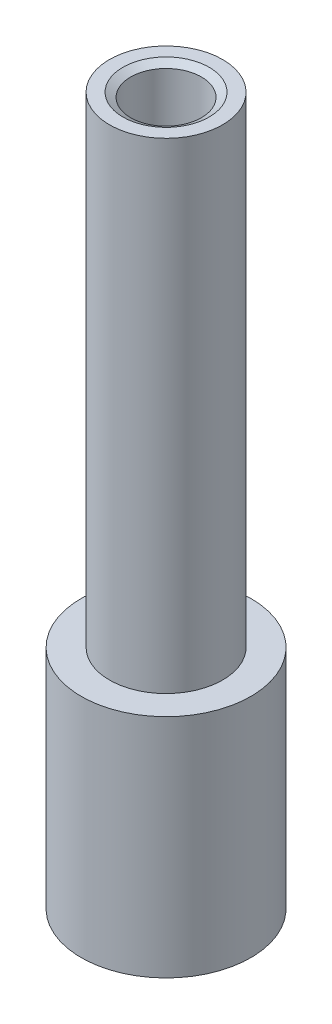
ISO-10303-21;
HEADER;
FILE_DESCRIPTION(('STEP AP214'),'2;1');
FILE_NAME('part.step','',(''),(''),'','','');
FILE_SCHEMA(('AUTOMOTIVE_DESIGN { 1 0 10303 214 1 1 1 1 }'));
ENDSEC;
DATA;
#1=APPLICATION_CONTEXT('core data for automotive mechanical design processes');
#2=APPLICATION_PROTOCOL_DEFINITION('international standard','automotive_design',2000,#1);
#3=PRODUCT_CONTEXT('',#1,'mechanical');
#4=PRODUCT('Part','Part','',(#3));
#5=PRODUCT_RELATED_PRODUCT_CATEGORY('part','',(#4));
#6=PRODUCT_DEFINITION_FORMATION('','',#4);
#7=PRODUCT_DEFINITION_CONTEXT('part definition',#1,'design');
#8=PRODUCT_DEFINITION('design','',#6,#7);
#9=PRODUCT_DEFINITION_SHAPE('','',#8);
#10=(LENGTH_UNIT() NAMED_UNIT(*) SI_UNIT(.MILLI.,.METRE.));
#11=(NAMED_UNIT(*) PLANE_ANGLE_UNIT() SI_UNIT($,.RADIAN.));
#12=(NAMED_UNIT(*) SI_UNIT($,.STERADIAN.) SOLID_ANGLE_UNIT());
#13=UNCERTAINTY_MEASURE_WITH_UNIT(LENGTH_MEASURE(1.E-05),#10,'distance_accuracy_value','');
#14=(GEOMETRIC_REPRESENTATION_CONTEXT(3) GLOBAL_UNCERTAINTY_ASSIGNED_CONTEXT((#13)) GLOBAL_UNIT_ASSIGNED_CONTEXT((#10,
#11,#12)) REPRESENTATION_CONTEXT('',''));
#15=CARTESIAN_POINT('',(0.,0.,0.));
#16=DIRECTION('',(0.,0.,1.));
#17=DIRECTION('',(1.,0.,0.));
#18=AXIS2_PLACEMENT_3D('',#15,#16,#17);
#19=CARTESIAN_POINT('',(0.,0.01,-3.));
#20=DIRECTION('',(0.,-1.,0.));
#21=DIRECTION('',(0.,0.,-1.));
#22=AXIS2_PLACEMENT_3D('',#19,#20,#21);
#23=PLANE('',#22);
#24=CARTESIAN_POINT('',(0.,0.01,0.));
#25=DIRECTION('',(0.,-1.,0.));
#26=DIRECTION('',(0.,0.,-1.));
#27=AXIS2_PLACEMENT_3D('',#24,#25,#26);
#28=CIRCLE('',#27,2.00767949192431);
#29=CARTESIAN_POINT('',(0.,0.01,-2.00767949192431));
#30=VERTEX_POINT('',#29);
#31=EDGE_CURVE('E39',#30,#30,#28,.T.);
#32=ORIENTED_EDGE('',*,*,#31,.F.);
#33=EDGE_LOOP('',(#32));
#34=FACE_BOUND('',#33,.T.);
#35=CARTESIAN_POINT('',(0.,0.01,0.));
#36=DIRECTION('',(0.,-1.,0.));
#37=DIRECTION('',(0.,0.,-1.));
#38=AXIS2_PLACEMENT_3D('',#35,#36,#37);
#39=CIRCLE('',#38,3.);
#40=CARTESIAN_POINT('',(0.,0.01,-3.));
#41=VERTEX_POINT('',#40);
#42=EDGE_CURVE('E11',#41,#41,#39,.T.);
#43=ORIENTED_EDGE('',*,*,#42,.T.);
#44=EDGE_LOOP('',(#43));
#45=FACE_BOUND('',#44,.T.);
#46=ADVANCED_FACE('F36',(#34,#45),#23,.T.);
#47=CARTESIAN_POINT('',(0.,0.,0.));
#48=DIRECTION('',(0.,-1.,0.));
#49=DIRECTION('',(0.,0.,-1.));
#50=AXIS2_PLACEMENT_3D('',#47,#48,#49);
#51=CYLINDRICAL_SURFACE('',#50,3.);
#52=CARTESIAN_POINT('',(0.,8.01,0.));
#53=DIRECTION('',(0.,-1.,0.));
#54=DIRECTION('',(0.,0.,-1.));
#55=AXIS2_PLACEMENT_3D('',#52,#53,#54);
#56=CIRCLE('',#55,3.);
#57=CARTESIAN_POINT('',(0.,8.01,-3.));
#58=VERTEX_POINT('',#57);
#59=EDGE_CURVE('E44',#58,#58,#56,.T.);
#60=ORIENTED_EDGE('',*,*,#59,.T.);
#61=EDGE_LOOP('',(#60));
#62=FACE_BOUND('',#61,.T.);
#63=ORIENTED_EDGE('',*,*,#42,.F.);
#64=EDGE_LOOP('',(#63));
#65=FACE_BOUND('',#64,.T.);
#66=ADVANCED_FACE('F84',(#62,#65),#51,.T.);
#67=CARTESIAN_POINT('',(0.,8.01,-3.));
#68=DIRECTION('',(0.,1.,0.));
#69=DIRECTION('',(0.,0.,1.));
#70=AXIS2_PLACEMENT_3D('',#67,#68,#69);
#71=PLANE('',#70);
#72=CARTESIAN_POINT('',(0.,8.01,0.));
#73=DIRECTION('',(0.,-1.,0.));
#74=DIRECTION('',(0.,0.,-1.));
#75=AXIS2_PLACEMENT_3D('',#72,#73,#74);
#76=CIRCLE('',#75,2.);
#77=CARTESIAN_POINT('',(0.,8.01,-2.));
#78=VERTEX_POINT('',#77);
#79=EDGE_CURVE('E78',#78,#78,#76,.T.);
#80=ORIENTED_EDGE('',*,*,#79,.T.);
#81=EDGE_LOOP('',(#80));
#82=FACE_BOUND('',#81,.T.);
#83=ORIENTED_EDGE('',*,*,#59,.F.);
#84=EDGE_LOOP('',(#83));
#85=FACE_BOUND('',#84,.T.);
#86=ADVANCED_FACE('F87',(#82,#85),#71,.T.);
#87=CARTESIAN_POINT('',(0.,0.,0.));
#88=DIRECTION('',(0.,-1.,0.));
#89=DIRECTION('',(0.,0.,-1.));
#90=AXIS2_PLACEMENT_3D('',#87,#88,#89);
#91=CYLINDRICAL_SURFACE('',#90,2.);
#92=CARTESIAN_POINT('',(0.,25.01,0.));
#93=DIRECTION('',(0.,-1.,0.));
#94=DIRECTION('',(0.,0.,-1.));
#95=AXIS2_PLACEMENT_3D('',#92,#93,#94);
#96=CIRCLE('',#95,2.);
#97=CARTESIAN_POINT('',(0.,25.01,-2.));
#98=VERTEX_POINT('',#97);
#99=EDGE_CURVE('E75',#98,#98,#96,.T.);
#100=ORIENTED_EDGE('',*,*,#99,.T.);
#101=EDGE_LOOP('',(#100));
#102=FACE_BOUND('',#101,.T.);
#103=ORIENTED_EDGE('',*,*,#79,.F.);
#104=EDGE_LOOP('',(#103));
#105=FACE_BOUND('',#104,.T.);
#106=ADVANCED_FACE('F89',(#102,#105),#91,.T.);
#107=CARTESIAN_POINT('',(0.,25.01,-2.));
#108=DIRECTION('',(0.,1.,0.));
#109=DIRECTION('',(0.,0.,1.));
#110=AXIS2_PLACEMENT_3D('',#107,#108,#109);
#111=PLANE('',#110);
#112=CARTESIAN_POINT('',(0.,25.01,0.));
#113=DIRECTION('',(0.,1.,0.));
#114=DIRECTION('',(0.,0.,1.));
#115=AXIS2_PLACEMENT_3D('',#112,#113,#114);
#116=CIRCLE('',#115,1.525);
#117=CARTESIAN_POINT('',(0.,25.01,1.525));
#118=VERTEX_POINT('',#117);
#119=EDGE_CURVE('E63',#118,#118,#116,.T.);
#120=ORIENTED_EDGE('',*,*,#119,.F.);
#121=EDGE_LOOP('',(#120));
#122=FACE_BOUND('',#121,.T.);
#123=ORIENTED_EDGE('',*,*,#99,.F.);
#124=EDGE_LOOP('',(#123));
#125=FACE_BOUND('',#124,.T.);
#126=ADVANCED_FACE('F96',(#122,#125),#111,.T.);
#127=CARTESIAN_POINT('',(0.,16.51,0.));
#128=DIRECTION('',(0.,1.,0.));
#129=DIRECTION('',(0.,0.,1.));
#130=AXIS2_PLACEMENT_3D('',#127,#128,#129);
#131=CONICAL_SURFACE('',#130,1.25,1.02974425867665);
#132=CARTESIAN_POINT('',(0.,15.7589242262155,0.));
#133=VERTEX_POINT('',#132);
#134=VERTEX_LOOP('',#133);
#135=FACE_BOUND('',#134,.T.);
#136=CARTESIAN_POINT('',(0.,16.51,0.));
#137=DIRECTION('',(0.,1.,0.));
#138=DIRECTION('',(0.,0.,1.));
#139=AXIS2_PLACEMENT_3D('',#136,#137,#138);
#140=CIRCLE('',#139,1.25);
#141=CARTESIAN_POINT('',(0.,16.51,1.25));
#142=VERTEX_POINT('',#141);
#143=EDGE_CURVE('E72',#142,#142,#140,.T.);
#144=ORIENTED_EDGE('',*,*,#143,.T.);
#145=EDGE_LOOP('',(#144));
#146=FACE_BOUND('',#145,.T.);
#147=ADVANCED_FACE('F124',(#135,#146),#131,.F.);
#148=CARTESIAN_POINT('',(0.,25.01,0.));
#149=DIRECTION('',(0.,1.,0.));
#150=DIRECTION('',(0.,0.,1.));
#151=AXIS2_PLACEMENT_3D('',#148,#149,#150);
#152=CYLINDRICAL_SURFACE('',#151,1.25);
#153=ORIENTED_EDGE('',*,*,#143,.F.);
#154=EDGE_LOOP('',(#153));
#155=FACE_BOUND('',#154,.T.);
#156=CARTESIAN_POINT('',(0.,24.8512286759729,0.));
#157=DIRECTION('',(0.,1.,0.));
#158=DIRECTION('',(0.,0.,1.));
#159=AXIS2_PLACEMENT_3D('',#156,#157,#158);
#160=CIRCLE('',#159,1.25);
#161=CARTESIAN_POINT('',(0.,24.8512286759729,1.25));
#162=VERTEX_POINT('',#161);
#163=EDGE_CURVE('E69',#162,#162,#160,.T.);
#164=ORIENTED_EDGE('',*,*,#163,.T.);
#165=EDGE_LOOP('',(#164));
#166=FACE_BOUND('',#165,.T.);
#167=ADVANCED_FACE('F120',(#155,#166),#152,.F.);
#168=CARTESIAN_POINT('',(0.,25.01,0.));
#169=DIRECTION('',(0.,1.,0.));
#170=DIRECTION('',(0.,0.,1.));
#171=AXIS2_PLACEMENT_3D('',#168,#169,#170);
#172=CONICAL_SURFACE('',#171,1.525,1.0471975511966);
#173=ORIENTED_EDGE('',*,*,#163,.F.);
#174=EDGE_LOOP('',(#173));
#175=FACE_BOUND('',#174,.T.);
#176=ORIENTED_EDGE('',*,*,#119,.T.);
#177=EDGE_LOOP('',(#176));
#178=FACE_BOUND('',#177,.T.);
#179=ADVANCED_FACE('F54',(#175,#178),#172,.F.);
#180=CARTESIAN_POINT('',(0.,6.,0.));
#181=DIRECTION('',(0.,-1.,0.));
#182=DIRECTION('',(0.,0.,-1.));
#183=AXIS2_PLACEMENT_3D('',#180,#181,#182);
#184=CONICAL_SURFACE('',#183,1.65,1.02974425867665);
#185=CARTESIAN_POINT('',(0.,6.99142002139547,0.));
#186=VERTEX_POINT('',#185);
#187=VERTEX_LOOP('',#186);
#188=FACE_BOUND('',#187,.T.);
#189=CARTESIAN_POINT('',(0.,6.,0.));
#190=DIRECTION('',(0.,-1.,0.));
#191=DIRECTION('',(0.,0.,-1.));
#192=AXIS2_PLACEMENT_3D('',#189,#190,#191);
#193=CIRCLE('',#192,1.65);
#194=CARTESIAN_POINT('',(0.,6.,-1.65));
#195=VERTEX_POINT('',#194);
#196=EDGE_CURVE('E58',#195,#195,#193,.T.);
#197=ORIENTED_EDGE('',*,*,#196,.T.);
#198=EDGE_LOOP('',(#197));
#199=FACE_BOUND('',#198,.T.);
#200=ADVANCED_FACE('F50',(#188,#199),#184,.F.);
#201=CARTESIAN_POINT('',(0.,0.,0.));
#202=DIRECTION('',(0.,-1.,0.));
#203=DIRECTION('',(0.,0.,-1.));
#204=AXIS2_PLACEMENT_3D('',#201,#202,#203);
#205=CYLINDRICAL_SURFACE('',#204,1.65);
#206=ORIENTED_EDGE('',*,*,#196,.F.);
#207=EDGE_LOOP('',(#206));
#208=FACE_BOUND('',#207,.T.);
#209=CARTESIAN_POINT('',(0.,0.21650635094611,0.));
#210=DIRECTION('',(0.,-1.,0.));
#211=DIRECTION('',(0.,0.,-1.));
#212=AXIS2_PLACEMENT_3D('',#209,#210,#211);
#213=CIRCLE('',#212,1.65);
#214=CARTESIAN_POINT('',(0.,0.21650635094611,-1.65));
#215=VERTEX_POINT('',#214);
#216=EDGE_CURVE('E60',#215,#215,#213,.T.);
#217=ORIENTED_EDGE('',*,*,#216,.T.);
#218=EDGE_LOOP('',(#217));
#219=FACE_BOUND('',#218,.T.);
#220=ADVANCED_FACE('F53',(#208,#219),#205,.F.);
#221=CARTESIAN_POINT('',(0.,0.,0.));
#222=DIRECTION('',(0.,-1.,0.));
#223=DIRECTION('',(0.,0.,-1.));
#224=AXIS2_PLACEMENT_3D('',#221,#222,#223);
#225=CONICAL_SURFACE('',#224,2.025,1.0471975511966);
#226=ORIENTED_EDGE('',*,*,#31,.T.);
#227=EDGE_LOOP('',(#226));
#228=FACE_BOUND('',#227,.T.);
#229=ORIENTED_EDGE('',*,*,#216,.F.);
#230=EDGE_LOOP('',(#229));
#231=FACE_BOUND('',#230,.T.);
#232=ADVANCED_FACE('F107',(#228,#231),#225,.F.);
#233=CLOSED_SHELL('',(#46,#66,#86,#106,#126,#147,#167,#179,#200,#220,#232));
#234=MANIFOLD_SOLID_BREP('B2',#233);
#235=ADVANCED_BREP_SHAPE_REPRESENTATION('',(#18,#234),#14);
#236=SHAPE_DEFINITION_REPRESENTATION(#9,#235);
ENDSEC;
END-ISO-10303-21;
